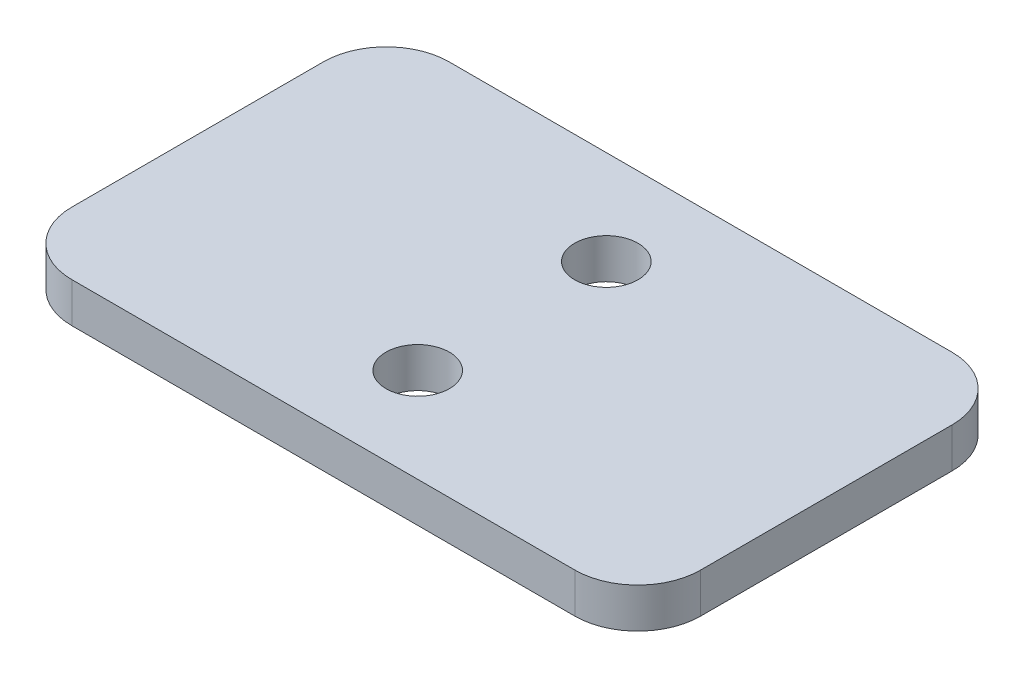
ISO-10303-21;
HEADER;
FILE_DESCRIPTION(('STEP AP214'),'2;1');
FILE_NAME('part.step','',(''),(''),'','','');
FILE_SCHEMA(('AUTOMOTIVE_DESIGN { 1 0 10303 214 1 1 1 1 }'));
ENDSEC;
DATA;
#1=APPLICATION_CONTEXT('core data for automotive mechanical design processes');
#2=APPLICATION_PROTOCOL_DEFINITION('international standard','automotive_design',2000,#1);
#3=PRODUCT_CONTEXT('',#1,'mechanical');
#4=PRODUCT('Part','Part','',(#3));
#5=PRODUCT_RELATED_PRODUCT_CATEGORY('part','',(#4));
#6=PRODUCT_DEFINITION_FORMATION('','',#4);
#7=PRODUCT_DEFINITION_CONTEXT('part definition',#1,'design');
#8=PRODUCT_DEFINITION('design','',#6,#7);
#9=PRODUCT_DEFINITION_SHAPE('','',#8);
#10=(LENGTH_UNIT() NAMED_UNIT(*) SI_UNIT(.MILLI.,.METRE.));
#11=(NAMED_UNIT(*) PLANE_ANGLE_UNIT() SI_UNIT($,.RADIAN.));
#12=(NAMED_UNIT(*) SI_UNIT($,.STERADIAN.) SOLID_ANGLE_UNIT());
#13=UNCERTAINTY_MEASURE_WITH_UNIT(LENGTH_MEASURE(1.E-05),#10,'distance_accuracy_value','');
#14=(GEOMETRIC_REPRESENTATION_CONTEXT(3) GLOBAL_UNCERTAINTY_ASSIGNED_CONTEXT((#13)) GLOBAL_UNIT_ASSIGNED_CONTEXT((#10,
#11,#12)) REPRESENTATION_CONTEXT('',''));
#15=CARTESIAN_POINT('',(0.,0.,0.));
#16=DIRECTION('',(0.,0.,1.));
#17=DIRECTION('',(1.,0.,0.));
#18=AXIS2_PLACEMENT_3D('',#15,#16,#17);
#19=CARTESIAN_POINT('',(-50.,6.35,30.));
#20=DIRECTION('',(0.,0.,-1.));
#21=DIRECTION('',(-1.,0.,0.));
#22=AXIS2_PLACEMENT_3D('',#19,#20,#21);
#23=PLANE('',#22);
#24=DIRECTION('',(1.,0.,0.));
#25=VECTOR('',#24,1.);
#26=CARTESIAN_POINT('',(-50.,6.35,30.));
#27=LINE('',#26,#25);
#28=CARTESIAN_POINT('',(-40.,6.35,30.));
#29=VERTEX_POINT('',#28);
#30=CARTESIAN_POINT('',(40.,6.35,30.));
#31=VERTEX_POINT('',#30);
#32=EDGE_CURVE('E128',#29,#31,#27,.T.);
#33=ORIENTED_EDGE('',*,*,#32,.F.);
#34=DIRECTION('',(0.,-1.,0.));
#35=VECTOR('',#34,1.);
#36=CARTESIAN_POINT('',(-40.,0.,30.));
#37=LINE('',#36,#35);
#38=CARTESIAN_POINT('',(-40.,0.,30.));
#39=VERTEX_POINT('',#38);
#40=EDGE_CURVE('E171',#29,#39,#37,.T.);
#41=ORIENTED_EDGE('',*,*,#40,.T.);
#42=DIRECTION('',(1.,0.,0.));
#43=VECTOR('',#42,1.);
#44=CARTESIAN_POINT('',(-50.,0.,30.));
#45=LINE('',#44,#43);
#46=CARTESIAN_POINT('',(40.,0.,30.));
#47=VERTEX_POINT('',#46);
#48=EDGE_CURVE('E110',#39,#47,#45,.T.);
#49=ORIENTED_EDGE('',*,*,#48,.T.);
#50=DIRECTION('',(0.,-1.,0.));
#51=VECTOR('',#50,1.);
#52=CARTESIAN_POINT('',(40.,6.35,30.));
#53=LINE('',#52,#51);
#54=EDGE_CURVE('E168',#47,#31,#53,.F.);
#55=ORIENTED_EDGE('',*,*,#54,.T.);
#56=EDGE_LOOP('',(#33,#41,#49,#55));
#57=FACE_BOUND('',#56,.T.);
#58=ADVANCED_FACE('F39',(#57),#23,.F.);
#59=CARTESIAN_POINT('',(50.,6.35,30.));
#60=DIRECTION('',(-1.,0.,0.));
#61=DIRECTION('',(0.,0.,1.));
#62=AXIS2_PLACEMENT_3D('',#59,#60,#61);
#63=PLANE('',#62);
#64=DIRECTION('',(0.,0.,-1.));
#65=VECTOR('',#64,1.);
#66=CARTESIAN_POINT('',(50.,0.,30.));
#67=LINE('',#66,#65);
#68=CARTESIAN_POINT('',(50.,0.,20.));
#69=VERTEX_POINT('',#68);
#70=CARTESIAN_POINT('',(50.,0.,-20.));
#71=VERTEX_POINT('',#70);
#72=EDGE_CURVE('E178',#69,#71,#67,.T.);
#73=ORIENTED_EDGE('',*,*,#72,.T.);
#74=DIRECTION('',(0.,-1.,0.));
#75=VECTOR('',#74,1.);
#76=CARTESIAN_POINT('',(50.,6.35,-20.));
#77=LINE('',#76,#75);
#78=CARTESIAN_POINT('',(50.,6.35,-20.));
#79=VERTEX_POINT('',#78);
#80=EDGE_CURVE('E11',#71,#79,#77,.F.);
#81=ORIENTED_EDGE('',*,*,#80,.T.);
#82=DIRECTION('',(0.,0.,-1.));
#83=VECTOR('',#82,1.);
#84=CARTESIAN_POINT('',(50.,6.35,30.));
#85=LINE('',#84,#83);
#86=CARTESIAN_POINT('',(50.,6.35,20.));
#87=VERTEX_POINT('',#86);
#88=EDGE_CURVE('E179',#87,#79,#85,.T.);
#89=ORIENTED_EDGE('',*,*,#88,.F.);
#90=DIRECTION('',(0.,-1.,0.));
#91=VECTOR('',#90,1.);
#92=CARTESIAN_POINT('',(50.,6.35,20.));
#93=LINE('',#92,#91);
#94=EDGE_CURVE('E48',#87,#69,#93,.T.);
#95=ORIENTED_EDGE('',*,*,#94,.T.);
#96=EDGE_LOOP('',(#73,#81,#89,#95));
#97=FACE_BOUND('',#96,.T.);
#98=ADVANCED_FACE('F177',(#97),#63,.F.);
#99=CARTESIAN_POINT('',(-50.,6.35,-30.));
#100=DIRECTION('',(0.,0.,-1.));
#101=DIRECTION('',(-1.,0.,0.));
#102=AXIS2_PLACEMENT_3D('',#99,#100,#101);
#103=PLANE('',#102);
#104=DIRECTION('',(1.,0.,0.));
#105=VECTOR('',#104,1.);
#106=CARTESIAN_POINT('',(-50.,0.,-30.));
#107=LINE('',#106,#105);
#108=CARTESIAN_POINT('',(-40.,0.,-30.));
#109=VERTEX_POINT('',#108);
#110=CARTESIAN_POINT('',(40.,0.,-30.));
#111=VERTEX_POINT('',#110);
#112=EDGE_CURVE('E129',#109,#111,#107,.T.);
#113=ORIENTED_EDGE('',*,*,#112,.F.);
#114=DIRECTION('',(0.,-1.,0.));
#115=VECTOR('',#114,1.);
#116=CARTESIAN_POINT('',(-40.,6.35,-30.));
#117=LINE('',#116,#115);
#118=CARTESIAN_POINT('',(-40.,6.35,-30.));
#119=VERTEX_POINT('',#118);
#120=EDGE_CURVE('E155',#109,#119,#117,.F.);
#121=ORIENTED_EDGE('',*,*,#120,.T.);
#122=DIRECTION('',(1.,0.,0.));
#123=VECTOR('',#122,1.);
#124=CARTESIAN_POINT('',(-50.,6.35,-30.));
#125=LINE('',#124,#123);
#126=CARTESIAN_POINT('',(40.,6.35,-30.));
#127=VERTEX_POINT('',#126);
#128=EDGE_CURVE('E141',#119,#127,#125,.T.);
#129=ORIENTED_EDGE('',*,*,#128,.T.);
#130=DIRECTION('',(0.,-1.,0.));
#131=VECTOR('',#130,1.);
#132=CARTESIAN_POINT('',(40.,0.,-30.));
#133=LINE('',#132,#131);
#134=EDGE_CURVE('E151',#127,#111,#133,.T.);
#135=ORIENTED_EDGE('',*,*,#134,.T.);
#136=EDGE_LOOP('',(#113,#121,#129,#135));
#137=FACE_BOUND('',#136,.T.);
#138=ADVANCED_FACE('F228',(#137),#103,.T.);
#139=CARTESIAN_POINT('',(-50.,6.35,30.));
#140=DIRECTION('',(-1.,0.,0.));
#141=DIRECTION('',(0.,0.,1.));
#142=AXIS2_PLACEMENT_3D('',#139,#140,#141);
#143=PLANE('',#142);
#144=DIRECTION('',(0.,0.,-1.));
#145=VECTOR('',#144,1.);
#146=CARTESIAN_POINT('',(-50.,6.35,30.));
#147=LINE('',#146,#145);
#148=CARTESIAN_POINT('',(-50.,6.35,20.));
#149=VERTEX_POINT('',#148);
#150=CARTESIAN_POINT('',(-50.,6.35,-20.));
#151=VERTEX_POINT('',#150);
#152=EDGE_CURVE('E135',#149,#151,#147,.T.);
#153=ORIENTED_EDGE('',*,*,#152,.T.);
#154=DIRECTION('',(0.,-1.,0.));
#155=VECTOR('',#154,1.);
#156=CARTESIAN_POINT('',(-50.,6.35,-20.));
#157=LINE('',#156,#155);
#158=CARTESIAN_POINT('',(-50.,0.,-20.));
#159=VERTEX_POINT('',#158);
#160=EDGE_CURVE('E126',#151,#159,#157,.T.);
#161=ORIENTED_EDGE('',*,*,#160,.T.);
#162=DIRECTION('',(0.,0.,-1.));
#163=VECTOR('',#162,1.);
#164=CARTESIAN_POINT('',(-50.,0.,30.));
#165=LINE('',#164,#163);
#166=CARTESIAN_POINT('',(-50.,0.,20.));
#167=VERTEX_POINT('',#166);
#168=EDGE_CURVE('E108',#167,#159,#165,.T.);
#169=ORIENTED_EDGE('',*,*,#168,.F.);
#170=DIRECTION('',(0.,-1.,0.));
#171=VECTOR('',#170,1.);
#172=CARTESIAN_POINT('',(-50.,6.35,20.));
#173=LINE('',#172,#171);
#174=EDGE_CURVE('E123',#167,#149,#173,.F.);
#175=ORIENTED_EDGE('',*,*,#174,.T.);
#176=EDGE_LOOP('',(#153,#161,#169,#175));
#177=FACE_BOUND('',#176,.T.);
#178=ADVANCED_FACE('F122',(#177),#143,.T.);
#179=CARTESIAN_POINT('',(0.,6.35,0.));
#180=DIRECTION('',(0.,1.,0.));
#181=DIRECTION('',(0.,0.,1.));
#182=AXIS2_PLACEMENT_3D('',#179,#180,#181);
#183=PLANE('',#182);
#184=CARTESIAN_POINT('',(0.,6.35,-15.));
#185=DIRECTION('',(0.,1.,0.));
#186=DIRECTION('',(0.,0.,1.));
#187=AXIS2_PLACEMENT_3D('',#184,#185,#186);
#188=CIRCLE('',#187,5.04189999999999);
#189=CARTESIAN_POINT('',(0.,6.35,-9.95810000000001));
#190=VERTEX_POINT('',#189);
#191=EDGE_CURVE('E207',#190,#190,#188,.T.);
#192=ORIENTED_EDGE('',*,*,#191,.F.);
#193=EDGE_LOOP('',(#192));
#194=FACE_BOUND('',#193,.T.);
#195=CARTESIAN_POINT('',(0.,6.35,15.));
#196=DIRECTION('',(0.,1.,0.));
#197=DIRECTION('',(0.,0.,1.));
#198=AXIS2_PLACEMENT_3D('',#195,#196,#197);
#199=CIRCLE('',#198,5.04189999999999);
#200=CARTESIAN_POINT('',(0.,6.35,20.0419));
#201=VERTEX_POINT('',#200);
#202=EDGE_CURVE('E199',#201,#201,#199,.T.);
#203=ORIENTED_EDGE('',*,*,#202,.F.);
#204=EDGE_LOOP('',(#203));
#205=FACE_BOUND('',#204,.T.);
#206=ORIENTED_EDGE('',*,*,#128,.F.);
#207=CARTESIAN_POINT('',(-40.,6.35,-20.));
#208=DIRECTION('',(0.,1.,0.));
#209=DIRECTION('',(0.,0.,1.));
#210=AXIS2_PLACEMENT_3D('',#207,#208,#209);
#211=CIRCLE('',#210,10.);
#212=EDGE_CURVE('E165',#119,#151,#211,.T.);
#213=ORIENTED_EDGE('',*,*,#212,.T.);
#214=ORIENTED_EDGE('',*,*,#152,.F.);
#215=CARTESIAN_POINT('',(-40.,6.35,20.));
#216=DIRECTION('',(0.,1.,0.));
#217=DIRECTION('',(0.,0.,1.));
#218=AXIS2_PLACEMENT_3D('',#215,#216,#217);
#219=CIRCLE('',#218,10.);
#220=EDGE_CURVE('E133',#149,#29,#219,.T.);
#221=ORIENTED_EDGE('',*,*,#220,.T.);
#222=ORIENTED_EDGE('',*,*,#32,.T.);
#223=CARTESIAN_POINT('',(40.,6.35,20.));
#224=DIRECTION('',(0.,1.,0.));
#225=DIRECTION('',(0.,0.,1.));
#226=AXIS2_PLACEMENT_3D('',#223,#224,#225);
#227=CIRCLE('',#226,10.);
#228=EDGE_CURVE('E60',#31,#87,#227,.T.);
#229=ORIENTED_EDGE('',*,*,#228,.T.);
#230=ORIENTED_EDGE('',*,*,#88,.T.);
#231=CARTESIAN_POINT('',(40.,6.35,-20.));
#232=DIRECTION('',(0.,1.,0.));
#233=DIRECTION('',(0.,0.,1.));
#234=AXIS2_PLACEMENT_3D('',#231,#232,#233);
#235=CIRCLE('',#234,10.);
#236=EDGE_CURVE('E160',#79,#127,#235,.T.);
#237=ORIENTED_EDGE('',*,*,#236,.T.);
#238=EDGE_LOOP('',(#206,#213,#214,#221,#222,#229,#230,#237));
#239=FACE_BOUND('',#238,.T.);
#240=ADVANCED_FACE('F214',(#194,#205,#239),#183,.T.);
#241=CARTESIAN_POINT('',(0.,0.,0.));
#242=DIRECTION('',(0.,1.,0.));
#243=DIRECTION('',(0.,0.,1.));
#244=AXIS2_PLACEMENT_3D('',#241,#242,#243);
#245=PLANE('',#244);
#246=CARTESIAN_POINT('',(0.,0.,-15.));
#247=DIRECTION('',(0.,1.,0.));
#248=DIRECTION('',(0.,0.,1.));
#249=AXIS2_PLACEMENT_3D('',#246,#247,#248);
#250=CIRCLE('',#249,5.0419);
#251=CARTESIAN_POINT('',(0.,0.,-9.9581));
#252=VERTEX_POINT('',#251);
#253=EDGE_CURVE('E203',#252,#252,#250,.T.);
#254=ORIENTED_EDGE('',*,*,#253,.T.);
#255=EDGE_LOOP('',(#254));
#256=FACE_BOUND('',#255,.T.);
#257=CARTESIAN_POINT('',(0.,0.,15.));
#258=DIRECTION('',(0.,1.,0.));
#259=DIRECTION('',(0.,0.,1.));
#260=AXIS2_PLACEMENT_3D('',#257,#258,#259);
#261=CIRCLE('',#260,5.0419);
#262=CARTESIAN_POINT('',(0.,0.,20.0419));
#263=VERTEX_POINT('',#262);
#264=EDGE_CURVE('E186',#263,#263,#261,.T.);
#265=ORIENTED_EDGE('',*,*,#264,.T.);
#266=EDGE_LOOP('',(#265));
#267=FACE_BOUND('',#266,.T.);
#268=ORIENTED_EDGE('',*,*,#168,.T.);
#269=CARTESIAN_POINT('',(-40.,0.,-20.));
#270=DIRECTION('',(0.,1.,0.));
#271=DIRECTION('',(0.,0.,1.));
#272=AXIS2_PLACEMENT_3D('',#269,#270,#271);
#273=CIRCLE('',#272,10.);
#274=EDGE_CURVE('E116',#159,#109,#273,.F.);
#275=ORIENTED_EDGE('',*,*,#274,.T.);
#276=ORIENTED_EDGE('',*,*,#112,.T.);
#277=CARTESIAN_POINT('',(40.,0.,-20.));
#278=DIRECTION('',(0.,1.,0.));
#279=DIRECTION('',(0.,0.,1.));
#280=AXIS2_PLACEMENT_3D('',#277,#278,#279);
#281=CIRCLE('',#280,10.);
#282=EDGE_CURVE('E117',#111,#71,#281,.F.);
#283=ORIENTED_EDGE('',*,*,#282,.T.);
#284=ORIENTED_EDGE('',*,*,#72,.F.);
#285=CARTESIAN_POINT('',(40.,0.,20.));
#286=DIRECTION('',(0.,1.,0.));
#287=DIRECTION('',(0.,0.,1.));
#288=AXIS2_PLACEMENT_3D('',#285,#286,#287);
#289=CIRCLE('',#288,10.);
#290=EDGE_CURVE('E139',#69,#47,#289,.F.);
#291=ORIENTED_EDGE('',*,*,#290,.T.);
#292=ORIENTED_EDGE('',*,*,#48,.F.);
#293=CARTESIAN_POINT('',(-40.,0.,20.));
#294=DIRECTION('',(0.,1.,0.));
#295=DIRECTION('',(0.,0.,1.));
#296=AXIS2_PLACEMENT_3D('',#293,#294,#295);
#297=CIRCLE('',#296,10.);
#298=EDGE_CURVE('E105',#39,#167,#297,.F.);
#299=ORIENTED_EDGE('',*,*,#298,.T.);
#300=EDGE_LOOP('',(#268,#275,#276,#283,#284,#291,#292,#299));
#301=FACE_BOUND('',#300,.T.);
#302=ADVANCED_FACE('F107',(#256,#267,#301),#245,.F.);
#303=CARTESIAN_POINT('',(0.,6.35,15.));
#304=DIRECTION('',(0.,1.,0.));
#305=DIRECTION('',(0.,0.,1.));
#306=AXIS2_PLACEMENT_3D('',#303,#304,#305);
#307=CYLINDRICAL_SURFACE('',#306,5.04189999999999);
#308=ORIENTED_EDGE('',*,*,#264,.F.);
#309=EDGE_LOOP('',(#308));
#310=FACE_BOUND('',#309,.T.);
#311=ORIENTED_EDGE('',*,*,#202,.T.);
#312=EDGE_LOOP('',(#311));
#313=FACE_BOUND('',#312,.T.);
#314=ADVANCED_FACE('F251',(#310,#313),#307,.F.);
#315=CARTESIAN_POINT('',(0.,6.35,-15.));
#316=DIRECTION('',(0.,1.,0.));
#317=DIRECTION('',(0.,0.,1.));
#318=AXIS2_PLACEMENT_3D('',#315,#316,#317);
#319=CYLINDRICAL_SURFACE('',#318,5.04189999999999);
#320=ORIENTED_EDGE('',*,*,#253,.F.);
#321=EDGE_LOOP('',(#320));
#322=FACE_BOUND('',#321,.T.);
#323=ORIENTED_EDGE('',*,*,#191,.T.);
#324=EDGE_LOOP('',(#323));
#325=FACE_BOUND('',#324,.T.);
#326=ADVANCED_FACE('F212',(#322,#325),#319,.F.);
#327=CARTESIAN_POINT('',(-40.,6.35,-20.));
#328=DIRECTION('',(0.,-1.,0.));
#329=DIRECTION('',(0.,0.,-1.));
#330=AXIS2_PLACEMENT_3D('',#327,#328,#329);
#331=CYLINDRICAL_SURFACE('',#330,10.);
#332=ORIENTED_EDGE('',*,*,#212,.F.);
#333=ORIENTED_EDGE('',*,*,#120,.F.);
#334=ORIENTED_EDGE('',*,*,#274,.F.);
#335=ORIENTED_EDGE('',*,*,#160,.F.);
#336=EDGE_LOOP('',(#332,#333,#334,#335));
#337=FACE_BOUND('',#336,.T.);
#338=ADVANCED_FACE('F226',(#337),#331,.T.);
#339=CARTESIAN_POINT('',(-40.,6.35,20.));
#340=DIRECTION('',(0.,1.,0.));
#341=DIRECTION('',(0.,0.,1.));
#342=AXIS2_PLACEMENT_3D('',#339,#340,#341);
#343=CYLINDRICAL_SURFACE('',#342,10.);
#344=ORIENTED_EDGE('',*,*,#220,.F.);
#345=ORIENTED_EDGE('',*,*,#174,.F.);
#346=ORIENTED_EDGE('',*,*,#298,.F.);
#347=ORIENTED_EDGE('',*,*,#40,.F.);
#348=EDGE_LOOP('',(#344,#345,#346,#347));
#349=FACE_BOUND('',#348,.T.);
#350=ADVANCED_FACE('F132',(#349),#343,.T.);
#351=CARTESIAN_POINT('',(40.,6.35,-20.));
#352=DIRECTION('',(0.,1.,0.));
#353=DIRECTION('',(0.,0.,1.));
#354=AXIS2_PLACEMENT_3D('',#351,#352,#353);
#355=CYLINDRICAL_SURFACE('',#354,10.);
#356=ORIENTED_EDGE('',*,*,#236,.F.);
#357=ORIENTED_EDGE('',*,*,#80,.F.);
#358=ORIENTED_EDGE('',*,*,#282,.F.);
#359=ORIENTED_EDGE('',*,*,#134,.F.);
#360=EDGE_LOOP('',(#356,#357,#358,#359));
#361=FACE_BOUND('',#360,.T.);
#362=ADVANCED_FACE('F230',(#361),#355,.T.);
#363=CARTESIAN_POINT('',(40.,6.35,20.));
#364=DIRECTION('',(0.,-1.,0.));
#365=DIRECTION('',(0.,0.,-1.));
#366=AXIS2_PLACEMENT_3D('',#363,#364,#365);
#367=CYLINDRICAL_SURFACE('',#366,10.);
#368=ORIENTED_EDGE('',*,*,#228,.F.);
#369=ORIENTED_EDGE('',*,*,#54,.F.);
#370=ORIENTED_EDGE('',*,*,#290,.F.);
#371=ORIENTED_EDGE('',*,*,#94,.F.);
#372=EDGE_LOOP('',(#368,#369,#370,#371));
#373=FACE_BOUND('',#372,.T.);
#374=ADVANCED_FACE('F41',(#373),#367,.T.);
#375=CLOSED_SHELL('',(#58,#98,#138,#178,#240,#302,#314,#326,#338,#350,#362,#374));
#376=MANIFOLD_SOLID_BREP('B2',#375);
#377=ADVANCED_BREP_SHAPE_REPRESENTATION('',(#18,#376),#14);
#378=SHAPE_DEFINITION_REPRESENTATION(#9,#377);
ENDSEC;
END-ISO-10303-21;
